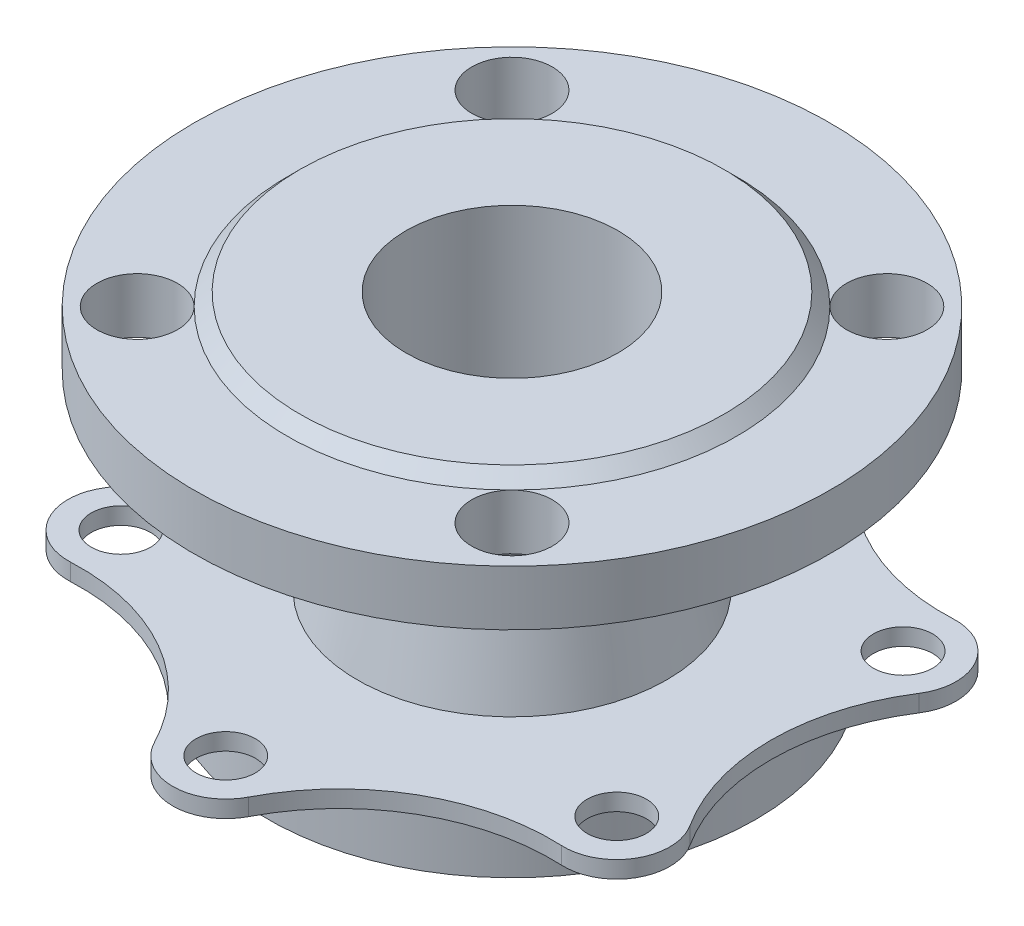
ISO-10303-21;
HEADER;
FILE_DESCRIPTION(('STEP AP214'),'2;1');
FILE_NAME('part.step','',(''),(''),'','','');
FILE_SCHEMA(('AUTOMOTIVE_DESIGN { 1 0 10303 214 1 1 1 1 }'));
ENDSEC;
DATA;
#1=APPLICATION_CONTEXT('core data for automotive mechanical design processes');
#2=APPLICATION_PROTOCOL_DEFINITION('international standard','automotive_design',2000,#1);
#3=PRODUCT_CONTEXT('',#1,'mechanical');
#4=PRODUCT('Part','Part','',(#3));
#5=PRODUCT_RELATED_PRODUCT_CATEGORY('part','',(#4));
#6=PRODUCT_DEFINITION_FORMATION('','',#4);
#7=PRODUCT_DEFINITION_CONTEXT('part definition',#1,'design');
#8=PRODUCT_DEFINITION('design','',#6,#7);
#9=PRODUCT_DEFINITION_SHAPE('','',#8);
#10=(LENGTH_UNIT() NAMED_UNIT(*) SI_UNIT(.MILLI.,.METRE.));
#11=(NAMED_UNIT(*) PLANE_ANGLE_UNIT() SI_UNIT($,.RADIAN.));
#12=(NAMED_UNIT(*) SI_UNIT($,.STERADIAN.) SOLID_ANGLE_UNIT());
#13=UNCERTAINTY_MEASURE_WITH_UNIT(LENGTH_MEASURE(1.E-05),#10,'distance_accuracy_value','');
#14=(GEOMETRIC_REPRESENTATION_CONTEXT(3) GLOBAL_UNCERTAINTY_ASSIGNED_CONTEXT((#13)) GLOBAL_UNIT_ASSIGNED_CONTEXT((#10,
#11,#12)) REPRESENTATION_CONTEXT('',''));
#15=CARTESIAN_POINT('',(0.,0.,0.));
#16=DIRECTION('',(0.,0.,1.));
#17=DIRECTION('',(1.,0.,0.));
#18=AXIS2_PLACEMENT_3D('',#15,#16,#17);
#19=CARTESIAN_POINT('',(-36.5,-22.5,0.));
#20=DIRECTION('',(0.,1.,0.));
#21=DIRECTION('',(-1.,0.,0.));
#22=AXIS2_PLACEMENT_3D('',#19,#20,#21);
#23=PLANE('',#22);
#24=CARTESIAN_POINT('',(-58.4567147554496,-22.5,33.75));
#25=DIRECTION('',(0.,1.,0.));
#26=DIRECTION('',(-1.,0.,0.));
#27=AXIS2_PLACEMENT_3D('',#24,#25,#26);
#28=CIRCLE('',#27,12.5);
#29=CARTESIAN_POINT('',(-57.8714496330299,-22.5,46.236291072071));
#30=VERTEX_POINT('',#29);
#31=CARTESIAN_POINT('',(-68.9775274617,-22.5,27.));
#32=VERTEX_POINT('',#31);
#33=EDGE_CURVE('E12',#30,#32,#28,.F.);
#34=ORIENTED_EDGE('',*,*,#33,.F.);
#35=CARTESIAN_POINT('',(-55.5303891433508,-22.5,96.1814553603548));
#36=DIRECTION('',(0.,1.,0.));
#37=DIRECTION('',(-1.,0.,0.));
#38=AXIS2_PLACEMENT_3D('',#35,#36,#37);
#39=CIRCLE('',#38,50.);
#40=CARTESIAN_POINT('',(-11.1060778286702,-22.5,73.236291072071));
#41=VERTEX_POINT('',#40);
#42=EDGE_CURVE('E351',#41,#30,#39,.T.);
#43=ORIENTED_EDGE('',*,*,#42,.F.);
#44=CARTESIAN_POINT('',(0.,-22.4999999999999,67.5));
#45=DIRECTION('',(0.,1.,0.));
#46=DIRECTION('',(-1.,0.,0.));
#47=AXIS2_PLACEMENT_3D('',#44,#45,#46);
#48=CIRCLE('',#47,12.5);
#49=CARTESIAN_POINT('',(11.1060778286702,-22.4999999999999,73.236291072071));
#50=VERTEX_POINT('',#49);
#51=EDGE_CURVE('E462',#50,#41,#48,.F.);
#52=ORIENTED_EDGE('',*,*,#51,.F.);
#53=CARTESIAN_POINT('',(55.5303891433508,-22.4999999999999,96.1814553603548));
#54=DIRECTION('',(0.,1.,0.));
#55=DIRECTION('',(-1.,0.,0.));
#56=AXIS2_PLACEMENT_3D('',#53,#54,#55);
#57=CIRCLE('',#56,50.);
#58=CARTESIAN_POINT('',(57.8714496330299,-22.4999999999999,46.236291072071));
#59=VERTEX_POINT('',#58);
#60=EDGE_CURVE('E356',#59,#50,#57,.T.);
#61=ORIENTED_EDGE('',*,*,#60,.F.);
#62=CARTESIAN_POINT('',(58.4567147554496,-22.4999999999999,33.75));
#63=DIRECTION('',(0.,1.,0.));
#64=DIRECTION('',(-1.,0.,0.));
#65=AXIS2_PLACEMENT_3D('',#62,#63,#64);
#66=CIRCLE('',#65,12.5);
#67=CARTESIAN_POINT('',(68.9775274617,-22.4999999999999,27.));
#68=VERTEX_POINT('',#67);
#69=EDGE_CURVE('E486',#68,#59,#66,.F.);
#70=ORIENTED_EDGE('',*,*,#69,.F.);
#71=CARTESIAN_POINT('',(111.060778286702,-22.4999999999999,0.));
#72=DIRECTION('',(0.,1.,0.));
#73=DIRECTION('',(-1.,0.,0.));
#74=AXIS2_PLACEMENT_3D('',#71,#72,#73);
#75=CIRCLE('',#74,50.);
#76=CARTESIAN_POINT('',(68.9775274617,-22.4999999999999,-27.));
#77=VERTEX_POINT('',#76);
#78=EDGE_CURVE('E360',#77,#68,#75,.T.);
#79=ORIENTED_EDGE('',*,*,#78,.F.);
#80=CARTESIAN_POINT('',(58.4567147554496,-22.4999999999999,-33.75));
#81=DIRECTION('',(0.,1.,0.));
#82=DIRECTION('',(-1.,0.,0.));
#83=AXIS2_PLACEMENT_3D('',#80,#81,#82);
#84=CIRCLE('',#83,12.5);
#85=CARTESIAN_POINT('',(57.8714496330299,-22.4999999999999,-46.236291072071));
#86=VERTEX_POINT('',#85);
#87=EDGE_CURVE('E468',#86,#77,#84,.F.);
#88=ORIENTED_EDGE('',*,*,#87,.F.);
#89=CARTESIAN_POINT('',(55.5303891433508,-22.4999999999999,-96.1814553603548));
#90=DIRECTION('',(0.,1.,0.));
#91=DIRECTION('',(-1.,0.,0.));
#92=AXIS2_PLACEMENT_3D('',#89,#90,#91);
#93=CIRCLE('',#92,50.);
#94=CARTESIAN_POINT('',(11.1060778286702,-22.4999999999999,-73.236291072071));
#95=VERTEX_POINT('',#94);
#96=EDGE_CURVE('E375',#95,#86,#93,.T.);
#97=ORIENTED_EDGE('',*,*,#96,.F.);
#98=CARTESIAN_POINT('',(0.,-22.4999999999999,-67.5));
#99=DIRECTION('',(0.,1.,0.));
#100=DIRECTION('',(-1.,0.,0.));
#101=AXIS2_PLACEMENT_3D('',#98,#99,#100);
#102=CIRCLE('',#101,12.5);
#103=CARTESIAN_POINT('',(-11.1060778286702,-22.5,-73.236291072071));
#104=VERTEX_POINT('',#103);
#105=EDGE_CURVE('E480',#104,#95,#102,.F.);
#106=ORIENTED_EDGE('',*,*,#105,.F.);
#107=CARTESIAN_POINT('',(-55.5303891433508,-22.5,-96.1814553603548));
#108=DIRECTION('',(0.,1.,0.));
#109=DIRECTION('',(-1.,0.,0.));
#110=AXIS2_PLACEMENT_3D('',#107,#108,#109);
#111=CIRCLE('',#110,50.);
#112=CARTESIAN_POINT('',(-57.8714496330298,-22.5,-46.236291072071));
#113=VERTEX_POINT('',#112);
#114=EDGE_CURVE('E407',#113,#104,#111,.T.);
#115=ORIENTED_EDGE('',*,*,#114,.F.);
#116=CARTESIAN_POINT('',(-58.4567147554496,-22.5,-33.75));
#117=DIRECTION('',(0.,1.,0.));
#118=DIRECTION('',(-1.,0.,0.));
#119=AXIS2_PLACEMENT_3D('',#116,#117,#118);
#120=CIRCLE('',#119,12.5);
#121=CARTESIAN_POINT('',(-68.9775274617,-22.5,-27.));
#122=VERTEX_POINT('',#121);
#123=EDGE_CURVE('E474',#122,#113,#120,.F.);
#124=ORIENTED_EDGE('',*,*,#123,.F.);
#125=CARTESIAN_POINT('',(-111.060778286702,-22.5,0.));
#126=DIRECTION('',(0.,1.,0.));
#127=DIRECTION('',(-1.,0.,0.));
#128=AXIS2_PLACEMENT_3D('',#125,#126,#127);
#129=CIRCLE('',#128,50.);
#130=EDGE_CURVE('E391',#32,#122,#129,.T.);
#131=ORIENTED_EDGE('',*,*,#130,.F.);
#132=EDGE_LOOP('',(#34,#43,#52,#61,#70,#79,#88,#97,#106,#115,#124,#131));
#133=FACE_BOUND('',#132,.T.);
#134=CARTESIAN_POINT('',(0.,-22.5,0.));
#135=DIRECTION('',(0.,1.,0.));
#136=DIRECTION('',(-1.,0.,0.));
#137=AXIS2_PLACEMENT_3D('',#134,#135,#136);
#138=CIRCLE('',#137,36.5);
#139=CARTESIAN_POINT('',(-36.5,-22.5,0.));
#140=VERTEX_POINT('',#139);
#141=EDGE_CURVE('E456',#140,#140,#138,.T.);
#142=ORIENTED_EDGE('',*,*,#141,.F.);
#143=EDGE_LOOP('',(#142));
#144=FACE_BOUND('',#143,.T.);
#145=CARTESIAN_POINT('',(0.,-22.5,-67.5));
#146=DIRECTION('',(0.,1.,0.));
#147=DIRECTION('',(-1.,0.,0.));
#148=AXIS2_PLACEMENT_3D('',#145,#146,#147);
#149=CIRCLE('',#148,7.);
#150=CARTESIAN_POINT('',(-7.,-22.5,-67.5));
#151=VERTEX_POINT('',#150);
#152=EDGE_CURVE('E443',#151,#151,#149,.T.);
#153=ORIENTED_EDGE('',*,*,#152,.F.);
#154=EDGE_LOOP('',(#153));
#155=FACE_BOUND('',#154,.T.);
#156=CARTESIAN_POINT('',(-58.4567147554496,-22.5,-33.75));
#157=DIRECTION('',(0.,1.,0.));
#158=DIRECTION('',(-1.,0.,0.));
#159=AXIS2_PLACEMENT_3D('',#156,#157,#158);
#160=CIRCLE('',#159,7.);
#161=CARTESIAN_POINT('',(-65.4567147554496,-22.5,-33.75));
#162=VERTEX_POINT('',#161);
#163=EDGE_CURVE('E332',#162,#162,#160,.T.);
#164=ORIENTED_EDGE('',*,*,#163,.F.);
#165=EDGE_LOOP('',(#164));
#166=FACE_BOUND('',#165,.T.);
#167=CARTESIAN_POINT('',(-58.4567147554496,-22.5,33.75));
#168=DIRECTION('',(0.,1.,0.));
#169=DIRECTION('',(-1.,0.,0.));
#170=AXIS2_PLACEMENT_3D('',#167,#168,#169);
#171=CIRCLE('',#170,7.);
#172=CARTESIAN_POINT('',(-65.4567147554496,-22.5,33.75));
#173=VERTEX_POINT('',#172);
#174=EDGE_CURVE('E313',#173,#173,#171,.T.);
#175=ORIENTED_EDGE('',*,*,#174,.F.);
#176=EDGE_LOOP('',(#175));
#177=FACE_BOUND('',#176,.T.);
#178=CARTESIAN_POINT('',(0.,-22.5,67.5));
#179=DIRECTION('',(0.,1.,0.));
#180=DIRECTION('',(-1.,0.,0.));
#181=AXIS2_PLACEMENT_3D('',#178,#179,#180);
#182=CIRCLE('',#181,7.);
#183=CARTESIAN_POINT('',(-7.,-22.5,67.5));
#184=VERTEX_POINT('',#183);
#185=EDGE_CURVE('E328',#184,#184,#182,.T.);
#186=ORIENTED_EDGE('',*,*,#185,.F.);
#187=EDGE_LOOP('',(#186));
#188=FACE_BOUND('',#187,.T.);
#189=CARTESIAN_POINT('',(58.4567147554496,-22.5,33.75));
#190=DIRECTION('',(0.,1.,0.));
#191=DIRECTION('',(-1.,0.,0.));
#192=AXIS2_PLACEMENT_3D('',#189,#190,#191);
#193=CIRCLE('',#192,7.);
#194=CARTESIAN_POINT('',(51.4567147554496,-22.5,33.75));
#195=VERTEX_POINT('',#194);
#196=EDGE_CURVE('E434',#195,#195,#193,.T.);
#197=ORIENTED_EDGE('',*,*,#196,.F.);
#198=EDGE_LOOP('',(#197));
#199=FACE_BOUND('',#198,.T.);
#200=CARTESIAN_POINT('',(58.4567147554496,-22.5,-33.75));
#201=DIRECTION('',(0.,1.,0.));
#202=DIRECTION('',(-1.,0.,0.));
#203=AXIS2_PLACEMENT_3D('',#200,#201,#202);
#204=CIRCLE('',#203,7.);
#205=CARTESIAN_POINT('',(51.4567147554496,-22.5,-33.75));
#206=VERTEX_POINT('',#205);
#207=EDGE_CURVE('E327',#206,#206,#204,.T.);
#208=ORIENTED_EDGE('',*,*,#207,.F.);
#209=EDGE_LOOP('',(#208));
#210=FACE_BOUND('',#209,.T.);
#211=ADVANCED_FACE('F166',(#133,#144,#155,#166,#177,#188,#199,#210),#23,.T.);
#212=CARTESIAN_POINT('',(0.,-26.5,0.));
#213=DIRECTION('',(0.,-1.,0.));
#214=DIRECTION('',(1.,0.,0.));
#215=AXIS2_PLACEMENT_3D('',#212,#213,#214);
#216=PLANE('',#215);
#217=CARTESIAN_POINT('',(-58.4567147554496,-26.5,33.75));
#218=DIRECTION('',(0.,-1.,0.));
#219=DIRECTION('',(1.,0.,0.));
#220=AXIS2_PLACEMENT_3D('',#217,#218,#219);
#221=CIRCLE('',#220,12.5);
#222=CARTESIAN_POINT('',(-57.8714496330299,-26.4999999999999,46.236291072071));
#223=VERTEX_POINT('',#222);
#224=CARTESIAN_POINT('',(-68.9775274617,-26.4999999999999,27.));
#225=VERTEX_POINT('',#224);
#226=EDGE_CURVE('E175',#223,#225,#221,.T.);
#227=ORIENTED_EDGE('',*,*,#226,.T.);
#228=CARTESIAN_POINT('',(-111.060778286702,-26.5,0.));
#229=DIRECTION('',(0.,-1.,0.));
#230=DIRECTION('',(1.,0.,0.));
#231=AXIS2_PLACEMENT_3D('',#228,#229,#230);
#232=CIRCLE('',#231,50.);
#233=CARTESIAN_POINT('',(-68.9775274617,-26.4999999999999,-27.));
#234=VERTEX_POINT('',#233);
#235=EDGE_CURVE('E355',#225,#234,#232,.F.);
#236=ORIENTED_EDGE('',*,*,#235,.T.);
#237=CARTESIAN_POINT('',(-58.4567147554496,-26.5,-33.75));
#238=DIRECTION('',(0.,-1.,0.));
#239=DIRECTION('',(1.,0.,0.));
#240=AXIS2_PLACEMENT_3D('',#237,#238,#239);
#241=CIRCLE('',#240,12.5);
#242=CARTESIAN_POINT('',(-57.8714496330298,-26.4999999999999,-46.236291072071));
#243=VERTEX_POINT('',#242);
#244=EDGE_CURVE('E471',#234,#243,#241,.T.);
#245=ORIENTED_EDGE('',*,*,#244,.T.);
#246=CARTESIAN_POINT('',(-55.5303891433508,-26.5,-96.1814553603548));
#247=DIRECTION('',(0.,-1.,0.));
#248=DIRECTION('',(1.,0.,0.));
#249=AXIS2_PLACEMENT_3D('',#246,#247,#248);
#250=CIRCLE('',#249,50.);
#251=CARTESIAN_POINT('',(-11.1060778286702,-26.4999999999999,-73.236291072071));
#252=VERTEX_POINT('',#251);
#253=EDGE_CURVE('E395',#243,#252,#250,.F.);
#254=ORIENTED_EDGE('',*,*,#253,.T.);
#255=CARTESIAN_POINT('',(0.,-26.5,-67.5));
#256=DIRECTION('',(0.,-1.,0.));
#257=DIRECTION('',(1.,0.,0.));
#258=AXIS2_PLACEMENT_3D('',#255,#256,#257);
#259=CIRCLE('',#258,12.5);
#260=CARTESIAN_POINT('',(11.1060778286702,-26.4999999999999,-73.236291072071));
#261=VERTEX_POINT('',#260);
#262=EDGE_CURVE('E477',#252,#261,#259,.T.);
#263=ORIENTED_EDGE('',*,*,#262,.T.);
#264=CARTESIAN_POINT('',(55.5303891433508,-26.5,-96.1814553603548));
#265=DIRECTION('',(0.,-1.,0.));
#266=DIRECTION('',(1.,0.,0.));
#267=AXIS2_PLACEMENT_3D('',#264,#265,#266);
#268=CIRCLE('',#267,50.);
#269=CARTESIAN_POINT('',(57.8714496330299,-26.4999999999999,-46.236291072071));
#270=VERTEX_POINT('',#269);
#271=EDGE_CURVE('E379',#261,#270,#268,.F.);
#272=ORIENTED_EDGE('',*,*,#271,.T.);
#273=CARTESIAN_POINT('',(58.4567147554496,-26.5,-33.75));
#274=DIRECTION('',(0.,-1.,0.));
#275=DIRECTION('',(1.,0.,0.));
#276=AXIS2_PLACEMENT_3D('',#273,#274,#275);
#277=CIRCLE('',#276,12.5);
#278=CARTESIAN_POINT('',(68.9775274617,-26.4999999999999,-27.));
#279=VERTEX_POINT('',#278);
#280=EDGE_CURVE('E465',#270,#279,#277,.T.);
#281=ORIENTED_EDGE('',*,*,#280,.T.);
#282=CARTESIAN_POINT('',(111.060778286702,-26.5,0.));
#283=DIRECTION('',(0.,-1.,0.));
#284=DIRECTION('',(1.,0.,0.));
#285=AXIS2_PLACEMENT_3D('',#282,#283,#284);
#286=CIRCLE('',#285,50.);
#287=CARTESIAN_POINT('',(68.9775274617,-26.4999999999999,27.));
#288=VERTEX_POINT('',#287);
#289=EDGE_CURVE('E363',#279,#288,#286,.F.);
#290=ORIENTED_EDGE('',*,*,#289,.T.);
#291=CARTESIAN_POINT('',(58.4567147554496,-26.5,33.75));
#292=DIRECTION('',(0.,-1.,0.));
#293=DIRECTION('',(1.,0.,0.));
#294=AXIS2_PLACEMENT_3D('',#291,#292,#293);
#295=CIRCLE('',#294,12.5);
#296=CARTESIAN_POINT('',(57.8714496330299,-26.4999999999999,46.236291072071));
#297=VERTEX_POINT('',#296);
#298=EDGE_CURVE('E483',#288,#297,#295,.T.);
#299=ORIENTED_EDGE('',*,*,#298,.T.);
#300=CARTESIAN_POINT('',(55.5303891433508,-26.5,96.1814553603548));
#301=DIRECTION('',(0.,-1.,0.));
#302=DIRECTION('',(1.,0.,0.));
#303=AXIS2_PLACEMENT_3D('',#300,#301,#302);
#304=CIRCLE('',#303,50.);
#305=CARTESIAN_POINT('',(11.1060778286702,-26.4999999999999,73.236291072071));
#306=VERTEX_POINT('',#305);
#307=EDGE_CURVE('E350',#297,#306,#304,.F.);
#308=ORIENTED_EDGE('',*,*,#307,.T.);
#309=CARTESIAN_POINT('',(0.,-26.5,67.5));
#310=DIRECTION('',(0.,-1.,0.));
#311=DIRECTION('',(1.,0.,0.));
#312=AXIS2_PLACEMENT_3D('',#309,#310,#311);
#313=CIRCLE('',#312,12.5);
#314=CARTESIAN_POINT('',(-11.1060778286702,-26.4999999999999,73.236291072071));
#315=VERTEX_POINT('',#314);
#316=EDGE_CURVE('E189',#306,#315,#313,.T.);
#317=ORIENTED_EDGE('',*,*,#316,.T.);
#318=CARTESIAN_POINT('',(-55.5303891433508,-26.5,96.1814553603548));
#319=DIRECTION('',(0.,-1.,0.));
#320=DIRECTION('',(1.,0.,0.));
#321=AXIS2_PLACEMENT_3D('',#318,#319,#320);
#322=CIRCLE('',#321,50.);
#323=EDGE_CURVE('E319',#315,#223,#322,.F.);
#324=ORIENTED_EDGE('',*,*,#323,.T.);
#325=EDGE_LOOP('',(#227,#236,#245,#254,#263,#272,#281,#290,#299,#308,#317,#324));
#326=FACE_BOUND('',#325,.T.);
#327=CARTESIAN_POINT('',(0.,-26.5,0.));
#328=DIRECTION('',(0.,-1.,0.));
#329=DIRECTION('',(1.,0.,0.));
#330=AXIS2_PLACEMENT_3D('',#327,#328,#329);
#331=CIRCLE('',#330,57.5);
#332=CARTESIAN_POINT('',(57.5,-26.5,0.));
#333=VERTEX_POINT('',#332);
#334=EDGE_CURVE('E371',#333,#333,#331,.T.);
#335=ORIENTED_EDGE('',*,*,#334,.F.);
#336=EDGE_LOOP('',(#335));
#337=FACE_BOUND('',#336,.T.);
#338=CARTESIAN_POINT('',(0.,-26.5,-67.5));
#339=DIRECTION('',(0.,-1.,0.));
#340=DIRECTION('',(1.,0.,0.));
#341=AXIS2_PLACEMENT_3D('',#338,#339,#340);
#342=CIRCLE('',#341,7.);
#343=CARTESIAN_POINT('',(7.,-26.5,-67.5));
#344=VERTEX_POINT('',#343);
#345=EDGE_CURVE('E421',#344,#344,#342,.T.);
#346=ORIENTED_EDGE('',*,*,#345,.F.);
#347=EDGE_LOOP('',(#346));
#348=FACE_BOUND('',#347,.T.);
#349=CARTESIAN_POINT('',(-58.4567147554496,-26.5,-33.75));
#350=DIRECTION('',(0.,-1.,0.));
#351=DIRECTION('',(1.,0.,0.));
#352=AXIS2_PLACEMENT_3D('',#349,#350,#351);
#353=CIRCLE('',#352,7.);
#354=CARTESIAN_POINT('',(-51.4567147554496,-26.5,-33.75));
#355=VERTEX_POINT('',#354);
#356=EDGE_CURVE('E314',#355,#355,#353,.T.);
#357=ORIENTED_EDGE('',*,*,#356,.F.);
#358=EDGE_LOOP('',(#357));
#359=FACE_BOUND('',#358,.T.);
#360=CARTESIAN_POINT('',(-58.4567147554496,-26.5,33.75));
#361=DIRECTION('',(0.,-1.,0.));
#362=DIRECTION('',(1.,0.,0.));
#363=AXIS2_PLACEMENT_3D('',#360,#361,#362);
#364=CIRCLE('',#363,7.);
#365=CARTESIAN_POINT('',(-51.4567147554496,-26.5,33.75));
#366=VERTEX_POINT('',#365);
#367=EDGE_CURVE('E435',#366,#366,#364,.T.);
#368=ORIENTED_EDGE('',*,*,#367,.F.);
#369=EDGE_LOOP('',(#368));
#370=FACE_BOUND('',#369,.T.);
#371=CARTESIAN_POINT('',(0.,-26.5,67.5));
#372=DIRECTION('',(0.,-1.,0.));
#373=DIRECTION('',(1.,0.,0.));
#374=AXIS2_PLACEMENT_3D('',#371,#372,#373);
#375=CIRCLE('',#374,7.);
#376=CARTESIAN_POINT('',(7.00000000000001,-26.5,67.5));
#377=VERTEX_POINT('',#376);
#378=EDGE_CURVE('E318',#377,#377,#375,.T.);
#379=ORIENTED_EDGE('',*,*,#378,.F.);
#380=EDGE_LOOP('',(#379));
#381=FACE_BOUND('',#380,.T.);
#382=CARTESIAN_POINT('',(58.4567147554496,-26.5,33.75));
#383=DIRECTION('',(0.,-1.,0.));
#384=DIRECTION('',(1.,0.,0.));
#385=AXIS2_PLACEMENT_3D('',#382,#383,#384);
#386=CIRCLE('',#385,7.);
#387=CARTESIAN_POINT('',(65.4567147554496,-26.5,33.75));
#388=VERTEX_POINT('',#387);
#389=EDGE_CURVE('E439',#388,#388,#386,.T.);
#390=ORIENTED_EDGE('',*,*,#389,.F.);
#391=EDGE_LOOP('',(#390));
#392=FACE_BOUND('',#391,.T.);
#393=CARTESIAN_POINT('',(58.4567147554496,-26.5,-33.75));
#394=DIRECTION('',(0.,-1.,0.));
#395=DIRECTION('',(1.,0.,0.));
#396=AXIS2_PLACEMENT_3D('',#393,#394,#395);
#397=CIRCLE('',#396,7.);
#398=CARTESIAN_POINT('',(65.4567147554496,-26.5,-33.75));
#399=VERTEX_POINT('',#398);
#400=EDGE_CURVE('E323',#399,#399,#397,.T.);
#401=ORIENTED_EDGE('',*,*,#400,.F.);
#402=EDGE_LOOP('',(#401));
#403=FACE_BOUND('',#402,.T.);
#404=ADVANCED_FACE('F168',(#326,#337,#348,#359,#370,#381,#392,#403),#216,.T.);
#405=CARTESIAN_POINT('',(-58.4567147554496,191.367766331313,33.75));
#406=DIRECTION('',(0.,-1.,0.));
#407=DIRECTION('',(1.,0.,0.));
#408=AXIS2_PLACEMENT_3D('',#405,#406,#407);
#409=CYLINDRICAL_SURFACE('',#408,12.5);
#410=ORIENTED_EDGE('',*,*,#226,.F.);
#411=DIRECTION('',(0.,-1.,0.));
#412=VECTOR('',#411,1.);
#413=CARTESIAN_POINT('',(-57.8714496330299,191.367766331313,46.2362910720709));
#414=LINE('',#413,#412);
#415=EDGE_CURVE('E344',#30,#223,#414,.T.);
#416=ORIENTED_EDGE('',*,*,#415,.F.);
#417=ORIENTED_EDGE('',*,*,#33,.T.);
#418=DIRECTION('',(0.,-1.,0.));
#419=VECTOR('',#418,1.);
#420=CARTESIAN_POINT('',(-68.9775274617,191.367766331313,27.));
#421=LINE('',#420,#419);
#422=EDGE_CURVE('E347',#32,#225,#421,.T.);
#423=ORIENTED_EDGE('',*,*,#422,.T.);
#424=EDGE_LOOP('',(#410,#416,#417,#423));
#425=FACE_BOUND('',#424,.T.);
#426=ADVANCED_FACE('F493',(#425),#409,.T.);
#427=CARTESIAN_POINT('',(58.4567147554496,191.367766331313,33.75));
#428=DIRECTION('',(0.,-1.,0.));
#429=DIRECTION('',(1.,0.,0.));
#430=AXIS2_PLACEMENT_3D('',#427,#428,#429);
#431=CYLINDRICAL_SURFACE('',#430,12.5);
#432=ORIENTED_EDGE('',*,*,#298,.F.);
#433=DIRECTION('',(0.,-1.,0.));
#434=VECTOR('',#433,1.);
#435=CARTESIAN_POINT('',(68.9775274617,191.367766331313,27.));
#436=LINE('',#435,#434);
#437=EDGE_CURVE('E367',#68,#288,#436,.T.);
#438=ORIENTED_EDGE('',*,*,#437,.F.);
#439=ORIENTED_EDGE('',*,*,#69,.T.);
#440=DIRECTION('',(0.,-1.,0.));
#441=VECTOR('',#440,1.);
#442=CARTESIAN_POINT('',(57.8714496330299,191.367766331313,46.236291072071));
#443=LINE('',#442,#441);
#444=EDGE_CURVE('E339',#59,#297,#443,.T.);
#445=ORIENTED_EDGE('',*,*,#444,.T.);
#446=EDGE_LOOP('',(#432,#438,#439,#445));
#447=FACE_BOUND('',#446,.T.);
#448=ADVANCED_FACE('F523',(#447),#431,.T.);
#449=CARTESIAN_POINT('',(0.,191.367766331313,-67.5));
#450=DIRECTION('',(0.,-1.,0.));
#451=DIRECTION('',(1.,0.,0.));
#452=AXIS2_PLACEMENT_3D('',#449,#450,#451);
#453=CYLINDRICAL_SURFACE('',#452,12.5);
#454=ORIENTED_EDGE('',*,*,#262,.F.);
#455=DIRECTION('',(0.,-1.,0.));
#456=VECTOR('',#455,1.);
#457=CARTESIAN_POINT('',(-11.1060778286702,191.367766331313,-73.236291072071));
#458=LINE('',#457,#456);
#459=EDGE_CURVE('E403',#104,#252,#458,.T.);
#460=ORIENTED_EDGE('',*,*,#459,.F.);
#461=ORIENTED_EDGE('',*,*,#105,.T.);
#462=DIRECTION('',(0.,-1.,0.));
#463=VECTOR('',#462,1.);
#464=CARTESIAN_POINT('',(11.1060778286702,191.367766331313,-73.236291072071));
#465=LINE('',#464,#463);
#466=EDGE_CURVE('E399',#95,#261,#465,.T.);
#467=ORIENTED_EDGE('',*,*,#466,.T.);
#468=EDGE_LOOP('',(#454,#460,#461,#467));
#469=FACE_BOUND('',#468,.T.);
#470=ADVANCED_FACE('F507',(#469),#453,.T.);
#471=CARTESIAN_POINT('',(-58.4567147554496,191.367766331313,-33.75));
#472=DIRECTION('',(0.,-1.,0.));
#473=DIRECTION('',(1.,0.,0.));
#474=AXIS2_PLACEMENT_3D('',#471,#472,#473);
#475=CYLINDRICAL_SURFACE('',#474,12.5);
#476=ORIENTED_EDGE('',*,*,#244,.F.);
#477=DIRECTION('',(0.,-1.,0.));
#478=VECTOR('',#477,1.);
#479=CARTESIAN_POINT('',(-68.9775274617,191.367766331313,-27.));
#480=LINE('',#479,#478);
#481=EDGE_CURVE('E411',#122,#234,#480,.T.);
#482=ORIENTED_EDGE('',*,*,#481,.F.);
#483=ORIENTED_EDGE('',*,*,#123,.T.);
#484=DIRECTION('',(0.,-1.,0.));
#485=VECTOR('',#484,1.);
#486=CARTESIAN_POINT('',(-57.8714496330298,191.367766331313,-46.236291072071));
#487=LINE('',#486,#485);
#488=EDGE_CURVE('E415',#113,#243,#487,.T.);
#489=ORIENTED_EDGE('',*,*,#488,.T.);
#490=EDGE_LOOP('',(#476,#482,#483,#489));
#491=FACE_BOUND('',#490,.T.);
#492=ADVANCED_FACE('F499',(#491),#475,.T.);
#493=CARTESIAN_POINT('',(58.4567147554496,191.367766331313,-33.75));
#494=DIRECTION('',(0.,-1.,0.));
#495=DIRECTION('',(1.,0.,0.));
#496=AXIS2_PLACEMENT_3D('',#493,#494,#495);
#497=CYLINDRICAL_SURFACE('',#496,12.5);
#498=ORIENTED_EDGE('',*,*,#280,.F.);
#499=DIRECTION('',(0.,-1.,0.));
#500=VECTOR('',#499,1.);
#501=CARTESIAN_POINT('',(57.8714496330299,191.367766331313,-46.236291072071));
#502=LINE('',#501,#500);
#503=EDGE_CURVE('E387',#86,#270,#502,.T.);
#504=ORIENTED_EDGE('',*,*,#503,.F.);
#505=ORIENTED_EDGE('',*,*,#87,.T.);
#506=DIRECTION('',(0.,-1.,0.));
#507=VECTOR('',#506,1.);
#508=CARTESIAN_POINT('',(68.9775274617,191.367766331313,-27.));
#509=LINE('',#508,#507);
#510=EDGE_CURVE('E383',#77,#279,#509,.T.);
#511=ORIENTED_EDGE('',*,*,#510,.T.);
#512=EDGE_LOOP('',(#498,#504,#505,#511));
#513=FACE_BOUND('',#512,.T.);
#514=ADVANCED_FACE('F517',(#513),#497,.T.);
#515=CARTESIAN_POINT('',(0.,191.367766331313,67.5));
#516=DIRECTION('',(0.,-1.,0.));
#517=DIRECTION('',(1.,0.,0.));
#518=AXIS2_PLACEMENT_3D('',#515,#516,#517);
#519=CYLINDRICAL_SURFACE('',#518,12.5);
#520=ORIENTED_EDGE('',*,*,#316,.F.);
#521=DIRECTION('',(0.,-1.,0.));
#522=VECTOR('',#521,1.);
#523=CARTESIAN_POINT('',(11.1060778286702,191.367766331313,73.236291072071));
#524=LINE('',#523,#522);
#525=EDGE_CURVE('E343',#50,#306,#524,.T.);
#526=ORIENTED_EDGE('',*,*,#525,.F.);
#527=ORIENTED_EDGE('',*,*,#51,.T.);
#528=DIRECTION('',(0.,-1.,0.));
#529=VECTOR('',#528,1.);
#530=CARTESIAN_POINT('',(-11.1060778286701,191.367766331313,73.236291072071));
#531=LINE('',#530,#529);
#532=EDGE_CURVE('E340',#41,#315,#531,.T.);
#533=ORIENTED_EDGE('',*,*,#532,.T.);
#534=EDGE_LOOP('',(#520,#526,#527,#533));
#535=FACE_BOUND('',#534,.T.);
#536=ADVANCED_FACE('F531',(#535),#519,.T.);
#537=CARTESIAN_POINT('',(0.,-47.4999999999999,-67.5));
#538=DIRECTION('',(0.,1.,0.));
#539=DIRECTION('',(-1.,0.,0.));
#540=AXIS2_PLACEMENT_3D('',#537,#538,#539);
#541=CYLINDRICAL_SURFACE('',#540,7.);
#542=ORIENTED_EDGE('',*,*,#152,.T.);
#543=EDGE_LOOP('',(#542));
#544=FACE_BOUND('',#543,.T.);
#545=ORIENTED_EDGE('',*,*,#345,.T.);
#546=EDGE_LOOP('',(#545));
#547=FACE_BOUND('',#546,.T.);
#548=ADVANCED_FACE('F567',(#544,#547),#541,.F.);
#549=CARTESIAN_POINT('',(-58.4567147554496,-47.4999999999999,33.75));
#550=DIRECTION('',(0.,1.,0.));
#551=DIRECTION('',(-1.,0.,0.));
#552=AXIS2_PLACEMENT_3D('',#549,#550,#551);
#553=CYLINDRICAL_SURFACE('',#552,7.);
#554=ORIENTED_EDGE('',*,*,#174,.T.);
#555=EDGE_LOOP('',(#554));
#556=FACE_BOUND('',#555,.T.);
#557=ORIENTED_EDGE('',*,*,#367,.T.);
#558=EDGE_LOOP('',(#557));
#559=FACE_BOUND('',#558,.T.);
#560=ADVANCED_FACE('F593',(#556,#559),#553,.F.);
#561=CARTESIAN_POINT('',(58.4567147554496,-47.5,33.75));
#562=DIRECTION('',(0.,1.,0.));
#563=DIRECTION('',(-1.,0.,0.));
#564=AXIS2_PLACEMENT_3D('',#561,#562,#563);
#565=CYLINDRICAL_SURFACE('',#564,7.);
#566=ORIENTED_EDGE('',*,*,#196,.T.);
#567=EDGE_LOOP('',(#566));
#568=FACE_BOUND('',#567,.T.);
#569=ORIENTED_EDGE('',*,*,#389,.T.);
#570=EDGE_LOOP('',(#569));
#571=FACE_BOUND('',#570,.T.);
#572=ADVANCED_FACE('F590',(#568,#571),#565,.F.);
#573=CARTESIAN_POINT('',(55.5303891433508,191.367766331313,96.1814553603548));
#574=DIRECTION('',(0.,-1.,0.));
#575=DIRECTION('',(1.,0.,0.));
#576=AXIS2_PLACEMENT_3D('',#573,#574,#575);
#577=CYLINDRICAL_SURFACE('',#576,50.);
#578=ORIENTED_EDGE('',*,*,#444,.F.);
#579=ORIENTED_EDGE('',*,*,#60,.T.);
#580=ORIENTED_EDGE('',*,*,#525,.T.);
#581=ORIENTED_EDGE('',*,*,#307,.F.);
#582=EDGE_LOOP('',(#578,#579,#580,#581));
#583=FACE_BOUND('',#582,.T.);
#584=ADVANCED_FACE('F527',(#583),#577,.F.);
#585=CARTESIAN_POINT('',(-55.5303891433508,191.367766331313,96.1814553603548));
#586=DIRECTION('',(0.,-1.,0.));
#587=DIRECTION('',(1.,0.,0.));
#588=AXIS2_PLACEMENT_3D('',#585,#586,#587);
#589=CYLINDRICAL_SURFACE('',#588,50.);
#590=ORIENTED_EDGE('',*,*,#532,.F.);
#591=ORIENTED_EDGE('',*,*,#42,.T.);
#592=ORIENTED_EDGE('',*,*,#415,.T.);
#593=ORIENTED_EDGE('',*,*,#323,.F.);
#594=EDGE_LOOP('',(#590,#591,#592,#593));
#595=FACE_BOUND('',#594,.T.);
#596=ADVANCED_FACE('F535',(#595),#589,.F.);
#597=CARTESIAN_POINT('',(55.5303891433508,191.367766331313,-96.1814553603548));
#598=DIRECTION('',(0.,-1.,0.));
#599=DIRECTION('',(1.,0.,0.));
#600=AXIS2_PLACEMENT_3D('',#597,#598,#599);
#601=CYLINDRICAL_SURFACE('',#600,50.);
#602=ORIENTED_EDGE('',*,*,#466,.F.);
#603=ORIENTED_EDGE('',*,*,#96,.T.);
#604=ORIENTED_EDGE('',*,*,#503,.T.);
#605=ORIENTED_EDGE('',*,*,#271,.F.);
#606=EDGE_LOOP('',(#602,#603,#604,#605));
#607=FACE_BOUND('',#606,.T.);
#608=ADVANCED_FACE('F512',(#607),#601,.F.);
#609=CARTESIAN_POINT('',(111.060778286702,191.367766331313,0.));
#610=DIRECTION('',(0.,-1.,0.));
#611=DIRECTION('',(1.,0.,0.));
#612=AXIS2_PLACEMENT_3D('',#609,#610,#611);
#613=CYLINDRICAL_SURFACE('',#612,50.);
#614=ORIENTED_EDGE('',*,*,#510,.F.);
#615=ORIENTED_EDGE('',*,*,#78,.T.);
#616=ORIENTED_EDGE('',*,*,#437,.T.);
#617=ORIENTED_EDGE('',*,*,#289,.F.);
#618=EDGE_LOOP('',(#614,#615,#616,#617));
#619=FACE_BOUND('',#618,.T.);
#620=ADVANCED_FACE('F520',(#619),#613,.F.);
#621=CARTESIAN_POINT('',(-111.060778286702,191.367766331313,0.));
#622=DIRECTION('',(0.,-1.,0.));
#623=DIRECTION('',(1.,0.,0.));
#624=AXIS2_PLACEMENT_3D('',#621,#622,#623);
#625=CYLINDRICAL_SURFACE('',#624,50.);
#626=ORIENTED_EDGE('',*,*,#422,.F.);
#627=ORIENTED_EDGE('',*,*,#130,.T.);
#628=ORIENTED_EDGE('',*,*,#481,.T.);
#629=ORIENTED_EDGE('',*,*,#235,.F.);
#630=EDGE_LOOP('',(#626,#627,#628,#629));
#631=FACE_BOUND('',#630,.T.);
#632=ADVANCED_FACE('F496',(#631),#625,.F.);
#633=CARTESIAN_POINT('',(-55.5303891433508,191.367766331313,-96.1814553603548));
#634=DIRECTION('',(0.,-1.,0.));
#635=DIRECTION('',(1.,0.,0.));
#636=AXIS2_PLACEMENT_3D('',#633,#634,#635);
#637=CYLINDRICAL_SURFACE('',#636,50.);
#638=ORIENTED_EDGE('',*,*,#488,.F.);
#639=ORIENTED_EDGE('',*,*,#114,.T.);
#640=ORIENTED_EDGE('',*,*,#459,.T.);
#641=ORIENTED_EDGE('',*,*,#253,.F.);
#642=EDGE_LOOP('',(#638,#639,#640,#641));
#643=FACE_BOUND('',#642,.T.);
#644=ADVANCED_FACE('F503',(#643),#637,.F.);
#645=CARTESIAN_POINT('',(58.4567147554496,-47.5,-33.75));
#646=DIRECTION('',(0.,1.,0.));
#647=DIRECTION('',(-1.,0.,0.));
#648=AXIS2_PLACEMENT_3D('',#645,#646,#647);
#649=CYLINDRICAL_SURFACE('',#648,7.);
#650=ORIENTED_EDGE('',*,*,#400,.T.);
#651=EDGE_LOOP('',(#650));
#652=FACE_BOUND('',#651,.T.);
#653=ORIENTED_EDGE('',*,*,#207,.T.);
#654=EDGE_LOOP('',(#653));
#655=FACE_BOUND('',#654,.T.);
#656=ADVANCED_FACE('F553',(#652,#655),#649,.F.);
#657=CARTESIAN_POINT('',(0.,-47.4999999999999,67.5));
#658=DIRECTION('',(0.,1.,0.));
#659=DIRECTION('',(-1.,0.,0.));
#660=AXIS2_PLACEMENT_3D('',#657,#658,#659);
#661=CYLINDRICAL_SURFACE('',#660,7.);
#662=ORIENTED_EDGE('',*,*,#378,.T.);
#663=EDGE_LOOP('',(#662));
#664=FACE_BOUND('',#663,.T.);
#665=ORIENTED_EDGE('',*,*,#185,.T.);
#666=EDGE_LOOP('',(#665));
#667=FACE_BOUND('',#666,.T.);
#668=ADVANCED_FACE('F555',(#664,#667),#661,.F.);
#669=CARTESIAN_POINT('',(-58.4567147554496,-47.4999999999999,-33.75));
#670=DIRECTION('',(0.,1.,0.));
#671=DIRECTION('',(-1.,0.,0.));
#672=AXIS2_PLACEMENT_3D('',#669,#670,#671);
#673=CYLINDRICAL_SURFACE('',#672,7.);
#674=ORIENTED_EDGE('',*,*,#356,.T.);
#675=EDGE_LOOP('',(#674));
#676=FACE_BOUND('',#675,.T.);
#677=ORIENTED_EDGE('',*,*,#163,.T.);
#678=EDGE_LOOP('',(#677));
#679=FACE_BOUND('',#678,.T.);
#680=ADVANCED_FACE('F563',(#676,#679),#673,.F.);
#681=CARTESIAN_POINT('',(-37.5,-47.4999999999999,0.));
#682=DIRECTION('',(0.,-1.,0.));
#683=DIRECTION('',(1.,0.,0.));
#684=AXIS2_PLACEMENT_3D('',#681,#682,#683);
#685=PLANE('',#684);
#686=CARTESIAN_POINT('',(0.,-47.4999999999999,0.));
#687=DIRECTION('',(0.,1.,0.));
#688=DIRECTION('',(-1.,0.,0.));
#689=AXIS2_PLACEMENT_3D('',#686,#687,#688);
#690=CIRCLE('',#689,35.);
#691=CARTESIAN_POINT('',(-35.,-47.4999999999999,0.));
#692=VERTEX_POINT('',#691);
#693=EDGE_CURVE('E301',#692,#692,#690,.T.);
#694=ORIENTED_EDGE('',*,*,#693,.T.);
#695=EDGE_LOOP('',(#694));
#696=FACE_BOUND('',#695,.T.);
#697=CARTESIAN_POINT('',(0.,-47.4999999999999,0.));
#698=DIRECTION('',(0.,1.,0.));
#699=DIRECTION('',(-1.,0.,0.));
#700=AXIS2_PLACEMENT_3D('',#697,#698,#699);
#701=CIRCLE('',#700,37.5);
#702=CARTESIAN_POINT('',(-37.5,-47.4999999999999,0.));
#703=VERTEX_POINT('',#702);
#704=EDGE_CURVE('E297',#703,#703,#701,.T.);
#705=ORIENTED_EDGE('',*,*,#704,.F.);
#706=EDGE_LOOP('',(#705));
#707=FACE_BOUND('',#706,.T.);
#708=ADVANCED_FACE('F611',(#696,#707),#685,.T.);
#709=CARTESIAN_POINT('',(0.,32.7942286340601,0.));
#710=DIRECTION('',(0.,1.,0.));
#711=DIRECTION('',(-1.,0.,0.));
#712=AXIS2_PLACEMENT_3D('',#709,#710,#711);
#713=CYLINDRICAL_SURFACE('',#712,35.);
#714=CARTESIAN_POINT('',(0.,-34.5,0.));
#715=DIRECTION('',(0.,1.,0.));
#716=DIRECTION('',(-1.,0.,0.));
#717=AXIS2_PLACEMENT_3D('',#714,#715,#716);
#718=CIRCLE('',#717,35.);
#719=CARTESIAN_POINT('',(-35.,-34.5,0.));
#720=VERTEX_POINT('',#719);
#721=EDGE_CURVE('E305',#720,#720,#718,.T.);
#722=ORIENTED_EDGE('',*,*,#721,.T.);
#723=EDGE_LOOP('',(#722));
#724=FACE_BOUND('',#723,.T.);
#725=ORIENTED_EDGE('',*,*,#693,.F.);
#726=EDGE_LOOP('',(#725));
#727=FACE_BOUND('',#726,.T.);
#728=ADVANCED_FACE('F616',(#724,#727),#713,.F.);
#729=CARTESIAN_POINT('',(-35.,-34.5,0.));
#730=DIRECTION('',(0.,-1.,0.));
#731=DIRECTION('',(1.,0.,0.));
#732=AXIS2_PLACEMENT_3D('',#729,#730,#731);
#733=PLANE('',#732);
#734=CARTESIAN_POINT('',(0.,-34.5,0.));
#735=DIRECTION('',(0.,1.,0.));
#736=DIRECTION('',(-1.,0.,0.));
#737=AXIS2_PLACEMENT_3D('',#734,#735,#736);
#738=CIRCLE('',#737,25.);
#739=CARTESIAN_POINT('',(-25.,-34.5,0.));
#740=VERTEX_POINT('',#739);
#741=EDGE_CURVE('E309',#740,#740,#738,.T.);
#742=ORIENTED_EDGE('',*,*,#741,.T.);
#743=EDGE_LOOP('',(#742));
#744=FACE_BOUND('',#743,.T.);
#745=ORIENTED_EDGE('',*,*,#721,.F.);
#746=EDGE_LOOP('',(#745));
#747=FACE_BOUND('',#746,.T.);
#748=ADVANCED_FACE('F637',(#744,#747),#733,.T.);
#749=CARTESIAN_POINT('',(0.,32.7942286340601,0.));
#750=DIRECTION('',(0.,1.,0.));
#751=DIRECTION('',(-1.,0.,0.));
#752=AXIS2_PLACEMENT_3D('',#749,#750,#751);
#753=CYLINDRICAL_SURFACE('',#752,25.);
#754=CARTESIAN_POINT('',(0.,-26.5,0.));
#755=DIRECTION('',(0.,-1.,0.));
#756=DIRECTION('',(1.,0.,0.));
#757=AXIS2_PLACEMENT_3D('',#754,#755,#756);
#758=CIRCLE('',#757,25.);
#759=CARTESIAN_POINT('',(25.,-26.5,0.));
#760=VERTEX_POINT('',#759);
#761=EDGE_CURVE('E692',#760,#760,#758,.F.);
#762=ORIENTED_EDGE('',*,*,#761,.T.);
#763=EDGE_LOOP('',(#762));
#764=FACE_BOUND('',#763,.T.);
#765=ORIENTED_EDGE('',*,*,#741,.F.);
#766=EDGE_LOOP('',(#765));
#767=FACE_BOUND('',#766,.T.);
#768=ADVANCED_FACE('F667',(#764,#767),#753,.F.);
#769=CARTESIAN_POINT('',(0.,-40.5,0.));
#770=DIRECTION('',(0.,1.,0.));
#771=DIRECTION('',(-1.,0.,0.));
#772=AXIS2_PLACEMENT_3D('',#769,#770,#771);
#773=CONICAL_SURFACE('',#772,38.9,0.197395559849884);
#774=ORIENTED_EDGE('',*,*,#704,.T.);
#775=EDGE_LOOP('',(#774));
#776=FACE_BOUND('',#775,.T.);
#777=CARTESIAN_POINT('',(0.,-40.5,0.));
#778=DIRECTION('',(0.,1.,0.));
#779=DIRECTION('',(-1.,0.,0.));
#780=AXIS2_PLACEMENT_3D('',#777,#778,#779);
#781=CIRCLE('',#780,38.9);
#782=CARTESIAN_POINT('',(-38.9,-40.5,0.));
#783=VERTEX_POINT('',#782);
#784=EDGE_CURVE('E293',#783,#783,#781,.T.);
#785=ORIENTED_EDGE('',*,*,#784,.F.);
#786=EDGE_LOOP('',(#785));
#787=FACE_BOUND('',#786,.T.);
#788=ADVANCED_FACE('F664',(#776,#787),#773,.T.);
#789=CARTESIAN_POINT('',(-57.5,-40.5,0.));
#790=DIRECTION('',(0.,-1.,0.));
#791=DIRECTION('',(1.,0.,0.));
#792=AXIS2_PLACEMENT_3D('',#789,#790,#791);
#793=PLANE('',#792);
#794=ORIENTED_EDGE('',*,*,#784,.T.);
#795=EDGE_LOOP('',(#794));
#796=FACE_BOUND('',#795,.T.);
#797=CARTESIAN_POINT('',(0.,-40.5,0.));
#798=DIRECTION('',(0.,1.,0.));
#799=DIRECTION('',(-1.,0.,0.));
#800=AXIS2_PLACEMENT_3D('',#797,#798,#799);
#801=CIRCLE('',#800,57.5);
#802=CARTESIAN_POINT('',(-57.5,-40.4999999999999,0.));
#803=VERTEX_POINT('',#802);
#804=EDGE_CURVE('E280',#803,#803,#801,.T.);
#805=ORIENTED_EDGE('',*,*,#804,.F.);
#806=EDGE_LOOP('',(#805));
#807=FACE_BOUND('',#806,.T.);
#808=ADVANCED_FACE('F571',(#796,#807),#793,.T.);
#809=CARTESIAN_POINT('',(0.,32.7942286340601,0.));
#810=DIRECTION('',(0.,1.,0.));
#811=DIRECTION('',(-1.,0.,0.));
#812=AXIS2_PLACEMENT_3D('',#809,#810,#811);
#813=CYLINDRICAL_SURFACE('',#812,57.5);
#814=ORIENTED_EDGE('',*,*,#804,.T.);
#815=EDGE_LOOP('',(#814));
#816=FACE_BOUND('',#815,.T.);
#817=ORIENTED_EDGE('',*,*,#334,.T.);
#818=EDGE_LOOP('',(#817));
#819=FACE_BOUND('',#818,.T.);
#820=ADVANCED_FACE('F558',(#816,#819),#813,.T.);
#821=CARTESIAN_POINT('',(0.,32.7942286340601,0.));
#822=DIRECTION('',(0.,1.,0.));
#823=DIRECTION('',(-1.,0.,0.));
#824=AXIS2_PLACEMENT_3D('',#821,#822,#823);
#825=CYLINDRICAL_SURFACE('',#824,75.);
#826=CARTESIAN_POINT('',(0.,35.4999999999999,0.));
#827=DIRECTION('',(0.,1.,0.));
#828=DIRECTION('',(-1.,0.,0.));
#829=AXIS2_PLACEMENT_3D('',#826,#827,#828);
#830=CIRCLE('',#829,75.);
#831=CARTESIAN_POINT('',(-75.,35.4999999999999,0.));
#832=VERTEX_POINT('',#831);
#833=EDGE_CURVE('E736',#832,#832,#830,.T.);
#834=ORIENTED_EDGE('',*,*,#833,.F.);
#835=EDGE_LOOP('',(#834));
#836=FACE_BOUND('',#835,.T.);
#837=CARTESIAN_POINT('',(0.,22.4999999999999,0.));
#838=DIRECTION('',(0.,1.,0.));
#839=DIRECTION('',(-1.,0.,0.));
#840=AXIS2_PLACEMENT_3D('',#837,#838,#839);
#841=CIRCLE('',#840,75.);
#842=CARTESIAN_POINT('',(-75.,22.4999999999999,0.));
#843=VERTEX_POINT('',#842);
#844=EDGE_CURVE('E740',#843,#843,#841,.T.);
#845=ORIENTED_EDGE('',*,*,#844,.T.);
#846=EDGE_LOOP('',(#845));
#847=FACE_BOUND('',#846,.T.);
#848=ADVANCED_FACE('F570',(#836,#847),#825,.T.);
#849=CARTESIAN_POINT('',(44.1941738241591,0.,-44.1941738241593));
#850=DIRECTION('',(0.,1.,0.));
#851=DIRECTION('',(-1.,0.,0.));
#852=AXIS2_PLACEMENT_3D('',#849,#850,#851);
#853=CYLINDRICAL_SURFACE('',#852,9.5);
#854=CARTESIAN_POINT('',(44.1941738241591,35.4999999999999,-44.1941738241593));
#855=DIRECTION('',(0.,1.,0.));
#856=DIRECTION('',(-1.,0.,0.));
#857=AXIS2_PLACEMENT_3D('',#854,#855,#856);
#858=CIRCLE('',#857,9.5);
#859=CARTESIAN_POINT('',(37.4766594028869,35.4999999999999,-37.4766594028871));
#860=VERTEX_POINT('',#859);
#861=EDGE_CURVE('E285',#860,#860,#858,.T.);
#862=ORIENTED_EDGE('',*,*,#861,.T.);
#863=EDGE_LOOP('',(#862));
#864=FACE_BOUND('',#863,.T.);
#865=CARTESIAN_POINT('',(44.1941738241591,22.4999999999999,-44.1941738241593));
#866=DIRECTION('',(0.,1.,0.));
#867=DIRECTION('',(-1.,0.,0.));
#868=AXIS2_PLACEMENT_3D('',#865,#866,#867);
#869=CIRCLE('',#868,9.5);
#870=CARTESIAN_POINT('',(34.6941738241591,22.4999999999999,-44.1941738241593));
#871=VERTEX_POINT('',#870);
#872=EDGE_CURVE('E719',#871,#871,#869,.T.);
#873=ORIENTED_EDGE('',*,*,#872,.F.);
#874=EDGE_LOOP('',(#873));
#875=FACE_BOUND('',#874,.T.);
#876=ADVANCED_FACE('F771',(#864,#875),#853,.F.);
#877=CARTESIAN_POINT('',(44.1941738241593,0.,44.1941738241591));
#878=DIRECTION('',(0.,1.,0.));
#879=DIRECTION('',(-1.,0.,0.));
#880=AXIS2_PLACEMENT_3D('',#877,#878,#879);
#881=CYLINDRICAL_SURFACE('',#880,9.5);
#882=CARTESIAN_POINT('',(44.1941738241593,35.4999999999999,44.1941738241591));
#883=DIRECTION('',(0.,1.,0.));
#884=DIRECTION('',(-1.,0.,0.));
#885=AXIS2_PLACEMENT_3D('',#882,#883,#884);
#886=CIRCLE('',#885,9.5);
#887=CARTESIAN_POINT('',(37.4766594028871,35.4999999999999,37.4766594028869));
#888=VERTEX_POINT('',#887);
#889=EDGE_CURVE('E282',#888,#888,#886,.T.);
#890=ORIENTED_EDGE('',*,*,#889,.T.);
#891=EDGE_LOOP('',(#890));
#892=FACE_BOUND('',#891,.T.);
#893=CARTESIAN_POINT('',(44.1941738241593,22.4999999999999,44.1941738241591));
#894=DIRECTION('',(0.,1.,0.));
#895=DIRECTION('',(-1.,0.,0.));
#896=AXIS2_PLACEMENT_3D('',#893,#894,#895);
#897=CIRCLE('',#896,9.5);
#898=CARTESIAN_POINT('',(34.6941738241593,22.4999999999999,44.1941738241591));
#899=VERTEX_POINT('',#898);
#900=EDGE_CURVE('E715',#899,#899,#897,.T.);
#901=ORIENTED_EDGE('',*,*,#900,.F.);
#902=EDGE_LOOP('',(#901));
#903=FACE_BOUND('',#902,.T.);
#904=ADVANCED_FACE('F778',(#892,#903),#881,.F.);
#905=CARTESIAN_POINT('',(-44.1941738241591,0.,44.1941738241593));
#906=DIRECTION('',(0.,1.,0.));
#907=DIRECTION('',(-1.,0.,0.));
#908=AXIS2_PLACEMENT_3D('',#905,#906,#907);
#909=CYLINDRICAL_SURFACE('',#908,9.5);
#910=CARTESIAN_POINT('',(-44.1941738241591,35.4999999999999,44.1941738241593));
#911=DIRECTION('',(0.,1.,0.));
#912=DIRECTION('',(-1.,0.,0.));
#913=AXIS2_PLACEMENT_3D('',#910,#911,#912);
#914=CIRCLE('',#913,9.5);
#915=CARTESIAN_POINT('',(-37.4766594028869,35.4999999999999,37.4766594028871));
#916=VERTEX_POINT('',#915);
#917=EDGE_CURVE('E275',#916,#916,#914,.T.);
#918=ORIENTED_EDGE('',*,*,#917,.T.);
#919=EDGE_LOOP('',(#918));
#920=FACE_BOUND('',#919,.T.);
#921=CARTESIAN_POINT('',(-44.1941738241591,22.4999999999999,44.1941738241593));
#922=DIRECTION('',(0.,1.,0.));
#923=DIRECTION('',(-1.,0.,0.));
#924=AXIS2_PLACEMENT_3D('',#921,#922,#923);
#925=CIRCLE('',#924,9.5);
#926=CARTESIAN_POINT('',(-53.6941738241591,22.4999999999999,44.1941738241593));
#927=VERTEX_POINT('',#926);
#928=EDGE_CURVE('E710',#927,#927,#925,.T.);
#929=ORIENTED_EDGE('',*,*,#928,.F.);
#930=EDGE_LOOP('',(#929));
#931=FACE_BOUND('',#930,.T.);
#932=ADVANCED_FACE('F782',(#920,#931),#909,.F.);
#933=CARTESIAN_POINT('',(-44.1941738241593,0.,-44.1941738241591));
#934=DIRECTION('',(0.,1.,0.));
#935=DIRECTION('',(-1.,0.,0.));
#936=AXIS2_PLACEMENT_3D('',#933,#934,#935);
#937=CYLINDRICAL_SURFACE('',#936,9.5);
#938=CARTESIAN_POINT('',(-44.1941738241593,35.4999999999999,-44.1941738241591));
#939=DIRECTION('',(0.,1.,0.));
#940=DIRECTION('',(-1.,0.,0.));
#941=AXIS2_PLACEMENT_3D('',#938,#939,#940);
#942=CIRCLE('',#941,9.5);
#943=CARTESIAN_POINT('',(-37.4766594028871,35.4999999999999,-37.476659402887));
#944=VERTEX_POINT('',#943);
#945=EDGE_CURVE('E267',#944,#944,#942,.T.);
#946=ORIENTED_EDGE('',*,*,#945,.T.);
#947=EDGE_LOOP('',(#946));
#948=FACE_BOUND('',#947,.T.);
#949=CARTESIAN_POINT('',(-44.1941738241593,22.4999999999999,-44.1941738241591));
#950=DIRECTION('',(0.,1.,0.));
#951=DIRECTION('',(-1.,0.,0.));
#952=AXIS2_PLACEMENT_3D('',#949,#950,#951);
#953=CIRCLE('',#952,9.5);
#954=CARTESIAN_POINT('',(-53.6941738241593,22.4999999999999,-44.1941738241591));
#955=VERTEX_POINT('',#954);
#956=EDGE_CURVE('E706',#955,#955,#953,.T.);
#957=ORIENTED_EDGE('',*,*,#956,.F.);
#958=EDGE_LOOP('',(#957));
#959=FACE_BOUND('',#958,.T.);
#960=ADVANCED_FACE('F268',(#948,#959),#937,.F.);
#961=CARTESIAN_POINT('',(0.,22.4999999999999,0.));
#962=DIRECTION('',(0.,1.,0.));
#963=DIRECTION('',(-1.,0.,0.));
#964=AXIS2_PLACEMENT_3D('',#961,#962,#963);
#965=PLANE('',#964);
#966=ORIENTED_EDGE('',*,*,#956,.T.);
#967=EDGE_LOOP('',(#966));
#968=FACE_BOUND('',#967,.T.);
#969=ORIENTED_EDGE('',*,*,#928,.T.);
#970=EDGE_LOOP('',(#969));
#971=FACE_BOUND('',#970,.T.);
#972=ORIENTED_EDGE('',*,*,#900,.T.);
#973=EDGE_LOOP('',(#972));
#974=FACE_BOUND('',#973,.T.);
#975=ORIENTED_EDGE('',*,*,#872,.T.);
#976=EDGE_LOOP('',(#975));
#977=FACE_BOUND('',#976,.T.);
#978=ORIENTED_EDGE('',*,*,#844,.F.);
#979=EDGE_LOOP('',(#978));
#980=FACE_BOUND('',#979,.T.);
#981=CARTESIAN_POINT('',(0.,22.4999999999999,0.));
#982=DIRECTION('',(0.,1.,0.));
#983=DIRECTION('',(-1.,0.,0.));
#984=AXIS2_PLACEMENT_3D('',#981,#982,#983);
#985=CIRCLE('',#984,36.5);
#986=CARTESIAN_POINT('',(-36.5,22.4999999999999,0.));
#987=VERTEX_POINT('',#986);
#988=EDGE_CURVE('E711',#987,#987,#985,.T.);
#989=ORIENTED_EDGE('',*,*,#988,.T.);
#990=EDGE_LOOP('',(#989));
#991=FACE_BOUND('',#990,.T.);
#992=ADVANCED_FACE('F747',(#968,#971,#974,#977,#980,#991),#965,.F.);
#993=CARTESIAN_POINT('',(0.,0.,0.));
#994=DIRECTION('',(0.,1.,0.));
#995=DIRECTION('',(-1.,0.,0.));
#996=AXIS2_PLACEMENT_3D('',#993,#994,#995);
#997=CONICAL_SURFACE('',#996,32.,0.197395559849881);
#998=ORIENTED_EDGE('',*,*,#988,.F.);
#999=EDGE_LOOP('',(#998));
#1000=FACE_BOUND('',#999,.T.);
#1001=CARTESIAN_POINT('',(0.,0.,0.));
#1002=DIRECTION('',(0.,1.,0.));
#1003=DIRECTION('',(-1.,0.,0.));
#1004=AXIS2_PLACEMENT_3D('',#1001,#1002,#1003);
#1005=CIRCLE('',#1004,32.);
#1006=CARTESIAN_POINT('',(-32.,0.,0.));
#1007=VERTEX_POINT('',#1006);
#1008=EDGE_CURVE('E274',#1007,#1007,#1005,.T.);
#1009=ORIENTED_EDGE('',*,*,#1008,.T.);
#1010=EDGE_LOOP('',(#1009));
#1011=FACE_BOUND('',#1010,.T.);
#1012=ADVANCED_FACE('F749',(#1000,#1011),#997,.T.);
#1013=CARTESIAN_POINT('',(0.,0.,0.));
#1014=DIRECTION('',(0.,-1.,0.));
#1015=DIRECTION('',(1.,0.,0.));
#1016=AXIS2_PLACEMENT_3D('',#1013,#1014,#1015);
#1017=CONICAL_SURFACE('',#1016,32.,0.197395559849881);
#1018=ORIENTED_EDGE('',*,*,#141,.T.);
#1019=EDGE_LOOP('',(#1018));
#1020=FACE_BOUND('',#1019,.T.);
#1021=ORIENTED_EDGE('',*,*,#1008,.F.);
#1022=EDGE_LOOP('',(#1021));
#1023=FACE_BOUND('',#1022,.T.);
#1024=ADVANCED_FACE('F660',(#1020,#1023),#1017,.T.);
#1025=CARTESIAN_POINT('',(0.,35.4999999999999,0.));
#1026=DIRECTION('',(0.,-1.,0.));
#1027=DIRECTION('',(1.,0.,0.));
#1028=AXIS2_PLACEMENT_3D('',#1025,#1026,#1027);
#1029=PLANE('',#1028);
#1030=CARTESIAN_POINT('',(0.,35.4999999999999,0.));
#1031=DIRECTION('',(0.,1.,0.));
#1032=DIRECTION('',(-1.,0.,0.));
#1033=AXIS2_PLACEMENT_3D('',#1030,#1031,#1032);
#1034=CIRCLE('',#1033,53.);
#1035=EDGE_CURVE('E735',#944,#916,#1034,.T.);
#1036=ORIENTED_EDGE('',*,*,#1035,.F.);
#1037=ORIENTED_EDGE('',*,*,#945,.F.);
#1038=EDGE_CURVE('E807',#860,#944,#1034,.T.);
#1039=ORIENTED_EDGE('',*,*,#1038,.F.);
#1040=ORIENTED_EDGE('',*,*,#861,.F.);
#1041=EDGE_CURVE('E734',#888,#860,#1034,.T.);
#1042=ORIENTED_EDGE('',*,*,#1041,.F.);
#1043=ORIENTED_EDGE('',*,*,#889,.F.);
#1044=EDGE_CURVE('E730',#916,#888,#1034,.T.);
#1045=ORIENTED_EDGE('',*,*,#1044,.F.);
#1046=ORIENTED_EDGE('',*,*,#917,.F.);
#1047=EDGE_LOOP('',(#1036,#1037,#1039,#1040,#1042,#1043,#1045,#1046));
#1048=FACE_BOUND('',#1047,.T.);
#1049=ORIENTED_EDGE('',*,*,#833,.T.);
#1050=EDGE_LOOP('',(#1049));
#1051=FACE_BOUND('',#1050,.T.);
#1052=ADVANCED_FACE('F756',(#1048,#1051),#1029,.F.);
#1053=CARTESIAN_POINT('',(0.,35.4999999999999,0.));
#1054=DIRECTION('',(0.,-1.,0.));
#1055=DIRECTION('',(1.,0.,0.));
#1056=AXIS2_PLACEMENT_3D('',#1053,#1054,#1055);
#1057=CONICAL_SURFACE('',#1056,53.,0.785398163397448);
#1058=CARTESIAN_POINT('',(0.,38.4999999999999,0.));
#1059=DIRECTION('',(0.,1.,0.));
#1060=DIRECTION('',(-1.,0.,0.));
#1061=AXIS2_PLACEMENT_3D('',#1058,#1059,#1060);
#1062=CIRCLE('',#1061,50.);
#1063=CARTESIAN_POINT('',(-50.,38.4999999999999,0.));
#1064=VERTEX_POINT('',#1063);
#1065=EDGE_CURVE('E726',#1064,#1064,#1062,.T.);
#1066=ORIENTED_EDGE('',*,*,#1065,.F.);
#1067=EDGE_LOOP('',(#1066));
#1068=FACE_BOUND('',#1067,.T.);
#1069=ORIENTED_EDGE('',*,*,#1044,.T.);
#1070=ORIENTED_EDGE('',*,*,#1041,.T.);
#1071=ORIENTED_EDGE('',*,*,#1038,.T.);
#1072=ORIENTED_EDGE('',*,*,#1035,.T.);
#1073=EDGE_LOOP('',(#1069,#1070,#1071,#1072));
#1074=FACE_BOUND('',#1073,.T.);
#1075=ADVANCED_FACE('F654',(#1068,#1074),#1057,.T.);
#1076=CARTESIAN_POINT('',(0.,38.4999999999999,0.));
#1077=DIRECTION('',(0.,1.,0.));
#1078=DIRECTION('',(-1.,0.,0.));
#1079=AXIS2_PLACEMENT_3D('',#1076,#1077,#1078);
#1080=PLANE('',#1079);
#1081=ORIENTED_EDGE('',*,*,#1065,.T.);
#1082=EDGE_LOOP('',(#1081));
#1083=FACE_BOUND('',#1082,.T.);
#1084=CARTESIAN_POINT('',(0.,38.5,0.));
#1085=DIRECTION('',(0.,1.,0.));
#1086=DIRECTION('',(-1.,0.,0.));
#1087=AXIS2_PLACEMENT_3D('',#1084,#1085,#1086);
#1088=CIRCLE('',#1087,25.);
#1089=CARTESIAN_POINT('',(-25.,38.5,0.));
#1090=VERTEX_POINT('',#1089);
#1091=EDGE_CURVE('E703',#1090,#1090,#1088,.T.);
#1092=ORIENTED_EDGE('',*,*,#1091,.F.);
#1093=EDGE_LOOP('',(#1092));
#1094=FACE_BOUND('',#1093,.T.);
#1095=ADVANCED_FACE('F644',(#1083,#1094),#1080,.T.);
#1096=CARTESIAN_POINT('',(0.,32.7942286340601,0.));
#1097=DIRECTION('',(0.,1.,0.));
#1098=DIRECTION('',(-1.,0.,0.));
#1099=AXIS2_PLACEMENT_3D('',#1096,#1097,#1098);
#1100=CYLINDRICAL_SURFACE('',#1099,25.);
#1101=CARTESIAN_POINT('',(0.,-22.5,0.));
#1102=DIRECTION('',(0.,1.,0.));
#1103=DIRECTION('',(-1.,0.,0.));
#1104=AXIS2_PLACEMENT_3D('',#1101,#1102,#1103);
#1105=CIRCLE('',#1104,25.);
#1106=CARTESIAN_POINT('',(-25.,-22.5,0.));
#1107=VERTEX_POINT('',#1106);
#1108=EDGE_CURVE('E700',#1107,#1107,#1105,.F.);
#1109=ORIENTED_EDGE('',*,*,#1108,.T.);
#1110=EDGE_LOOP('',(#1109));
#1111=FACE_BOUND('',#1110,.T.);
#1112=ORIENTED_EDGE('',*,*,#1091,.T.);
#1113=EDGE_LOOP('',(#1112));
#1114=FACE_BOUND('',#1113,.T.);
#1115=ADVANCED_FACE('F619',(#1111,#1114),#1100,.F.);
#1116=CARTESIAN_POINT('',(-36.5,-22.5,0.));
#1117=DIRECTION('',(0.,1.,0.));
#1118=DIRECTION('',(-1.,0.,0.));
#1119=AXIS2_PLACEMENT_3D('',#1116,#1117,#1118);
#1120=PLANE('',#1119);
#1121=ORIENTED_EDGE('',*,*,#1108,.F.);
#1122=EDGE_LOOP('',(#1121));
#1123=FACE_BOUND('',#1122,.T.);
#1124=ADVANCED_FACE('F643',(#1123),#1120,.T.);
#1125=CARTESIAN_POINT('',(0.,-26.5,0.));
#1126=DIRECTION('',(0.,-1.,0.));
#1127=DIRECTION('',(1.,0.,0.));
#1128=AXIS2_PLACEMENT_3D('',#1125,#1126,#1127);
#1129=PLANE('',#1128);
#1130=ORIENTED_EDGE('',*,*,#761,.F.);
#1131=EDGE_LOOP('',(#1130));
#1132=FACE_BOUND('',#1131,.T.);
#1133=ADVANCED_FACE('F651',(#1132),#1129,.T.);
#1134=CLOSED_SHELL('',(#211,#404,#426,#448,#470,#492,#514,#536,#548,#560,#572,#584,#596,#608,
#620,#632,#644,#656,#668,#680,#708,#728,#748,#768,#788,#808,#820,#848,#876,#904,#932,#960,#992,
#1012,#1024,#1052,#1075,#1095,#1115,#1124,#1133));
#1135=MANIFOLD_SOLID_BREP('B2',#1134);
#1136=ADVANCED_BREP_SHAPE_REPRESENTATION('',(#18,#1135),#14);
#1137=SHAPE_DEFINITION_REPRESENTATION(#9,#1136);
ENDSEC;
END-ISO-10303-21;
